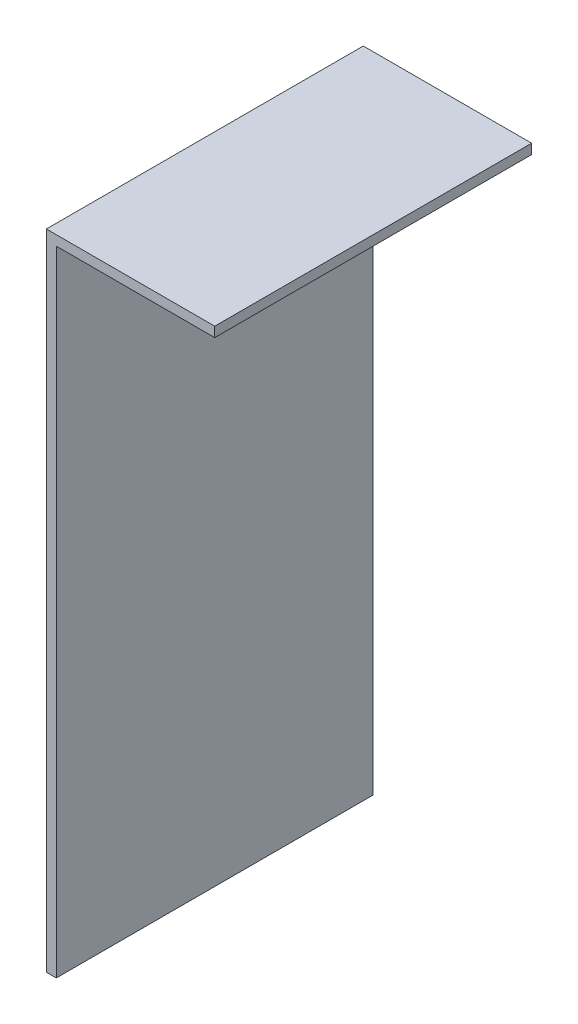
ISO-10303-21;
HEADER;
FILE_DESCRIPTION(('STEP AP214'),'2;1');
FILE_NAME('part.step','',(''),(''),'','','');
FILE_SCHEMA(('AUTOMOTIVE_DESIGN { 1 0 10303 214 1 1 1 1 }'));
ENDSEC;
DATA;
#1=APPLICATION_CONTEXT('core data for automotive mechanical design processes');
#2=APPLICATION_PROTOCOL_DEFINITION('international standard','automotive_design',2000,#1);
#3=PRODUCT_CONTEXT('',#1,'mechanical');
#4=PRODUCT('Part','Part','',(#3));
#5=PRODUCT_RELATED_PRODUCT_CATEGORY('part','',(#4));
#6=PRODUCT_DEFINITION_FORMATION('','',#4);
#7=PRODUCT_DEFINITION_CONTEXT('part definition',#1,'design');
#8=PRODUCT_DEFINITION('design','',#6,#7);
#9=PRODUCT_DEFINITION_SHAPE('','',#8);
#10=(LENGTH_UNIT() NAMED_UNIT(*) SI_UNIT(.MILLI.,.METRE.));
#11=(NAMED_UNIT(*) PLANE_ANGLE_UNIT() SI_UNIT($,.RADIAN.));
#12=(NAMED_UNIT(*) SI_UNIT($,.STERADIAN.) SOLID_ANGLE_UNIT());
#13=UNCERTAINTY_MEASURE_WITH_UNIT(LENGTH_MEASURE(1.E-05),#10,'distance_accuracy_value','');
#14=(GEOMETRIC_REPRESENTATION_CONTEXT(3) GLOBAL_UNCERTAINTY_ASSIGNED_CONTEXT((#13)) GLOBAL_UNIT_ASSIGNED_CONTEXT((#10,
#11,#12)) REPRESENTATION_CONTEXT('',''));
#15=CARTESIAN_POINT('',(0.,0.,0.));
#16=DIRECTION('',(0.,0.,1.));
#17=DIRECTION('',(1.,0.,0.));
#18=AXIS2_PLACEMENT_3D('',#15,#16,#17);
#19=CARTESIAN_POINT('',(3.17499999999999,0.,101.6));
#20=DIRECTION('',(-1.,0.,0.));
#21=DIRECTION('',(0.,-1.,0.));
#22=AXIS2_PLACEMENT_3D('',#19,#20,#21);
#23=PLANE('',#22);
#24=DIRECTION('',(0.,1.,0.));
#25=VECTOR('',#24,1.);
#26=CARTESIAN_POINT('',(3.17499999999999,0.,0.));
#27=LINE('',#26,#25);
#28=CARTESIAN_POINT('',(3.17499999999999,0.,0.));
#29=VERTEX_POINT('',#28);
#30=CARTESIAN_POINT('',(3.17499999999996,203.2,0.));
#31=VERTEX_POINT('',#30);
#32=EDGE_CURVE('E119',#29,#31,#27,.T.);
#33=ORIENTED_EDGE('',*,*,#32,.T.);
#34=DIRECTION('',(0.,0.,-1.));
#35=VECTOR('',#34,1.);
#36=CARTESIAN_POINT('',(3.17499999999996,203.2,101.6));
#37=LINE('',#36,#35);
#38=CARTESIAN_POINT('',(3.17499999999996,203.2,101.6));
#39=VERTEX_POINT('',#38);
#40=EDGE_CURVE('E11',#39,#31,#37,.T.);
#41=ORIENTED_EDGE('',*,*,#40,.F.);
#42=DIRECTION('',(0.,1.,0.));
#43=VECTOR('',#42,1.);
#44=CARTESIAN_POINT('',(3.17499999999999,0.,101.6));
#45=LINE('',#44,#43);
#46=CARTESIAN_POINT('',(3.17499999999999,0.,101.6));
#47=VERTEX_POINT('',#46);
#48=EDGE_CURVE('E131',#47,#39,#45,.T.);
#49=ORIENTED_EDGE('',*,*,#48,.F.);
#50=DIRECTION('',(0.,0.,-1.));
#51=VECTOR('',#50,1.);
#52=CARTESIAN_POINT('',(3.17499999999999,0.,101.6));
#53=LINE('',#52,#51);
#54=EDGE_CURVE('E115',#47,#29,#53,.T.);
#55=ORIENTED_EDGE('',*,*,#54,.T.);
#56=EDGE_LOOP('',(#33,#41,#49,#55));
#57=FACE_BOUND('',#56,.T.);
#58=ADVANCED_FACE('F37',(#57),#23,.F.);
#59=CARTESIAN_POINT('',(0.,203.2,101.6));
#60=DIRECTION('',(0.,1.,0.));
#61=DIRECTION('',(0.,0.,1.));
#62=AXIS2_PLACEMENT_3D('',#59,#60,#61);
#63=PLANE('',#62);
#64=DIRECTION('',(1.,0.,0.));
#65=VECTOR('',#64,1.);
#66=CARTESIAN_POINT('',(0.,203.2,0.));
#67=LINE('',#66,#65);
#68=CARTESIAN_POINT('',(53.975,203.2,0.));
#69=VERTEX_POINT('',#68);
#70=EDGE_CURVE('E122',#31,#69,#67,.T.);
#71=ORIENTED_EDGE('',*,*,#70,.T.);
#72=DIRECTION('',(0.,0.,-1.));
#73=VECTOR('',#72,1.);
#74=CARTESIAN_POINT('',(53.975,203.2,101.6));
#75=LINE('',#74,#73);
#76=CARTESIAN_POINT('',(53.975,203.2,101.6));
#77=VERTEX_POINT('',#76);
#78=EDGE_CURVE('E45',#77,#69,#75,.T.);
#79=ORIENTED_EDGE('',*,*,#78,.F.);
#80=DIRECTION('',(1.,0.,0.));
#81=VECTOR('',#80,1.);
#82=CARTESIAN_POINT('',(0.,203.2,101.6));
#83=LINE('',#82,#81);
#84=EDGE_CURVE('E86',#39,#77,#83,.T.);
#85=ORIENTED_EDGE('',*,*,#84,.F.);
#86=ORIENTED_EDGE('',*,*,#40,.T.);
#87=EDGE_LOOP('',(#71,#79,#85,#86));
#88=FACE_BOUND('',#87,.T.);
#89=ADVANCED_FACE('F155',(#88),#63,.F.);
#90=CARTESIAN_POINT('',(53.975,0.,101.6));
#91=DIRECTION('',(-1.,0.,0.));
#92=DIRECTION('',(0.,0.,1.));
#93=AXIS2_PLACEMENT_3D('',#90,#91,#92);
#94=PLANE('',#93);
#95=DIRECTION('',(0.,1.,0.));
#96=VECTOR('',#95,1.);
#97=CARTESIAN_POINT('',(53.975,0.,0.));
#98=LINE('',#97,#96);
#99=CARTESIAN_POINT('',(53.975,206.375,0.));
#100=VERTEX_POINT('',#99);
#101=EDGE_CURVE('E124',#69,#100,#98,.T.);
#102=ORIENTED_EDGE('',*,*,#101,.T.);
#103=DIRECTION('',(0.,0.,-1.));
#104=VECTOR('',#103,1.);
#105=CARTESIAN_POINT('',(53.975,206.375,101.6));
#106=LINE('',#105,#104);
#107=CARTESIAN_POINT('',(53.975,206.375,101.6));
#108=VERTEX_POINT('',#107);
#109=EDGE_CURVE('E105',#108,#100,#106,.T.);
#110=ORIENTED_EDGE('',*,*,#109,.F.);
#111=DIRECTION('',(0.,1.,0.));
#112=VECTOR('',#111,1.);
#113=CARTESIAN_POINT('',(53.975,0.,101.6));
#114=LINE('',#113,#112);
#115=EDGE_CURVE('E110',#77,#108,#114,.T.);
#116=ORIENTED_EDGE('',*,*,#115,.F.);
#117=ORIENTED_EDGE('',*,*,#78,.T.);
#118=EDGE_LOOP('',(#102,#110,#116,#117));
#119=FACE_BOUND('',#118,.T.);
#120=ADVANCED_FACE('F137',(#119),#94,.F.);
#121=CARTESIAN_POINT('',(0.,206.375,101.6));
#122=DIRECTION('',(0.,1.,0.));
#123=DIRECTION('',(0.,0.,1.));
#124=AXIS2_PLACEMENT_3D('',#121,#122,#123);
#125=PLANE('',#124);
#126=DIRECTION('',(1.,0.,0.));
#127=VECTOR('',#126,1.);
#128=CARTESIAN_POINT('',(0.,206.375,0.));
#129=LINE('',#128,#127);
#130=CARTESIAN_POINT('',(0.,206.375,0.));
#131=VERTEX_POINT('',#130);
#132=EDGE_CURVE('E100',#131,#100,#129,.T.);
#133=ORIENTED_EDGE('',*,*,#132,.F.);
#134=DIRECTION('',(0.,0.,-1.));
#135=VECTOR('',#134,1.);
#136=CARTESIAN_POINT('',(0.,206.375,101.6));
#137=LINE('',#136,#135);
#138=CARTESIAN_POINT('',(0.,206.375,101.6));
#139=VERTEX_POINT('',#138);
#140=EDGE_CURVE('E95',#139,#131,#137,.T.);
#141=ORIENTED_EDGE('',*,*,#140,.F.);
#142=DIRECTION('',(1.,0.,0.));
#143=VECTOR('',#142,1.);
#144=CARTESIAN_POINT('',(0.,206.375,101.6));
#145=LINE('',#144,#143);
#146=EDGE_CURVE('E98',#139,#108,#145,.T.);
#147=ORIENTED_EDGE('',*,*,#146,.T.);
#148=ORIENTED_EDGE('',*,*,#109,.T.);
#149=EDGE_LOOP('',(#133,#141,#147,#148));
#150=FACE_BOUND('',#149,.T.);
#151=ADVANCED_FACE('F97',(#150),#125,.T.);
#152=CARTESIAN_POINT('',(0.,0.,101.6));
#153=DIRECTION('',(-1.,0.,0.));
#154=DIRECTION('',(0.,0.,1.));
#155=AXIS2_PLACEMENT_3D('',#152,#153,#154);
#156=PLANE('',#155);
#157=DIRECTION('',(0.,1.,0.));
#158=VECTOR('',#157,1.);
#159=CARTESIAN_POINT('',(0.,0.,0.));
#160=LINE('',#159,#158);
#161=CARTESIAN_POINT('',(0.,0.,0.));
#162=VERTEX_POINT('',#161);
#163=EDGE_CURVE('E128',#162,#131,#160,.T.);
#164=ORIENTED_EDGE('',*,*,#163,.F.);
#165=DIRECTION('',(0.,0.,-1.));
#166=VECTOR('',#165,1.);
#167=CARTESIAN_POINT('',(0.,0.,101.6));
#168=LINE('',#167,#166);
#169=CARTESIAN_POINT('',(0.,0.,101.6));
#170=VERTEX_POINT('',#169);
#171=EDGE_CURVE('E75',#170,#162,#168,.T.);
#172=ORIENTED_EDGE('',*,*,#171,.F.);
#173=DIRECTION('',(0.,1.,0.));
#174=VECTOR('',#173,1.);
#175=CARTESIAN_POINT('',(0.,0.,101.6));
#176=LINE('',#175,#174);
#177=EDGE_CURVE('E108',#170,#139,#176,.T.);
#178=ORIENTED_EDGE('',*,*,#177,.T.);
#179=ORIENTED_EDGE('',*,*,#140,.T.);
#180=EDGE_LOOP('',(#164,#172,#178,#179));
#181=FACE_BOUND('',#180,.T.);
#182=ADVANCED_FACE('F113',(#181),#156,.T.);
#183=CARTESIAN_POINT('',(0.,0.,101.6));
#184=DIRECTION('',(0.,1.,0.));
#185=DIRECTION('',(0.,0.,1.));
#186=AXIS2_PLACEMENT_3D('',#183,#184,#185);
#187=PLANE('',#186);
#188=DIRECTION('',(1.,0.,0.));
#189=VECTOR('',#188,1.);
#190=CARTESIAN_POINT('',(0.,0.,0.));
#191=LINE('',#190,#189);
#192=EDGE_CURVE('E78',#162,#29,#191,.T.);
#193=ORIENTED_EDGE('',*,*,#192,.T.);
#194=ORIENTED_EDGE('',*,*,#54,.F.);
#195=DIRECTION('',(1.,0.,0.));
#196=VECTOR('',#195,1.);
#197=CARTESIAN_POINT('',(0.,0.,101.6));
#198=LINE('',#197,#196);
#199=EDGE_CURVE('E53',#170,#47,#198,.T.);
#200=ORIENTED_EDGE('',*,*,#199,.F.);
#201=ORIENTED_EDGE('',*,*,#171,.T.);
#202=EDGE_LOOP('',(#193,#194,#200,#201));
#203=FACE_BOUND('',#202,.T.);
#204=ADVANCED_FACE('F144',(#203),#187,.F.);
#205=CARTESIAN_POINT('',(0.,0.,101.6));
#206=DIRECTION('',(0.,0.,1.));
#207=DIRECTION('',(1.,0.,0.));
#208=AXIS2_PLACEMENT_3D('',#205,#206,#207);
#209=PLANE('',#208);
#210=ORIENTED_EDGE('',*,*,#48,.T.);
#211=ORIENTED_EDGE('',*,*,#84,.T.);
#212=ORIENTED_EDGE('',*,*,#115,.T.);
#213=ORIENTED_EDGE('',*,*,#146,.F.);
#214=ORIENTED_EDGE('',*,*,#177,.F.);
#215=ORIENTED_EDGE('',*,*,#199,.T.);
#216=EDGE_LOOP('',(#210,#211,#212,#213,#214,#215));
#217=FACE_BOUND('',#216,.T.);
#218=ADVANCED_FACE('F107',(#217),#209,.T.);
#219=CARTESIAN_POINT('',(0.,0.,0.));
#220=DIRECTION('',(0.,0.,1.));
#221=DIRECTION('',(1.,0.,0.));
#222=AXIS2_PLACEMENT_3D('',#219,#220,#221);
#223=PLANE('',#222);
#224=ORIENTED_EDGE('',*,*,#32,.F.);
#225=ORIENTED_EDGE('',*,*,#192,.F.);
#226=ORIENTED_EDGE('',*,*,#163,.T.);
#227=ORIENTED_EDGE('',*,*,#132,.T.);
#228=ORIENTED_EDGE('',*,*,#101,.F.);
#229=ORIENTED_EDGE('',*,*,#70,.F.);
#230=EDGE_LOOP('',(#224,#225,#226,#227,#228,#229));
#231=FACE_BOUND('',#230,.T.);
#232=ADVANCED_FACE('F140',(#231),#223,.F.);
#233=CLOSED_SHELL('',(#58,#89,#120,#151,#182,#204,#218,#232));
#234=MANIFOLD_SOLID_BREP('B2',#233);
#235=ADVANCED_BREP_SHAPE_REPRESENTATION('',(#18,#234),#14);
#236=SHAPE_DEFINITION_REPRESENTATION(#9,#235);
ENDSEC;
END-ISO-10303-21;
